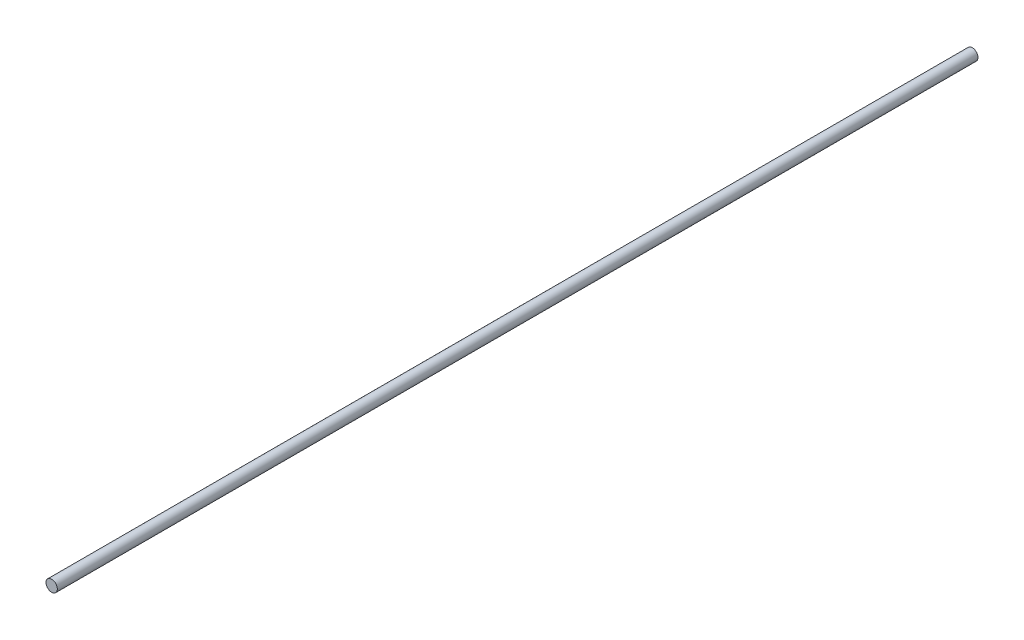
ISO-10303-21;
HEADER;
FILE_DESCRIPTION(('STEP AP214'),'2;1');
FILE_NAME('part.step','',(''),(''),'','','');
FILE_SCHEMA(('AUTOMOTIVE_DESIGN { 1 0 10303 214 1 1 1 1 }'));
ENDSEC;
DATA;
#1=APPLICATION_CONTEXT('core data for automotive mechanical design processes');
#2=APPLICATION_PROTOCOL_DEFINITION('international standard','automotive_design',2000,#1);
#3=PRODUCT_CONTEXT('',#1,'mechanical');
#4=PRODUCT('Part','Part','',(#3));
#5=PRODUCT_RELATED_PRODUCT_CATEGORY('part','',(#4));
#6=PRODUCT_DEFINITION_FORMATION('','',#4);
#7=PRODUCT_DEFINITION_CONTEXT('part definition',#1,'design');
#8=PRODUCT_DEFINITION('design','',#6,#7);
#9=PRODUCT_DEFINITION_SHAPE('','',#8);
#10=(LENGTH_UNIT() NAMED_UNIT(*) SI_UNIT(.MILLI.,.METRE.));
#11=(NAMED_UNIT(*) PLANE_ANGLE_UNIT() SI_UNIT($,.RADIAN.));
#12=(NAMED_UNIT(*) SI_UNIT($,.STERADIAN.) SOLID_ANGLE_UNIT());
#13=UNCERTAINTY_MEASURE_WITH_UNIT(LENGTH_MEASURE(1.E-05),#10,'distance_accuracy_value','');
#14=(GEOMETRIC_REPRESENTATION_CONTEXT(3) GLOBAL_UNCERTAINTY_ASSIGNED_CONTEXT((#13)) GLOBAL_UNIT_ASSIGNED_CONTEXT((#10,
#11,#12)) REPRESENTATION_CONTEXT('',''));
#15=CARTESIAN_POINT('',(0.,0.,0.));
#16=DIRECTION('',(0.,0.,1.));
#17=DIRECTION('',(1.,0.,0.));
#18=AXIS2_PLACEMENT_3D('',#15,#16,#17);
#19=CARTESIAN_POINT('',(0.,0.,-162.));
#20=DIRECTION('',(0.,0.,1.));
#21=DIRECTION('',(1.,0.,0.));
#22=AXIS2_PLACEMENT_3D('',#19,#20,#21);
#23=CYLINDRICAL_SURFACE('',#22,2.);
#24=CARTESIAN_POINT('',(0.,0.,-162.));
#25=DIRECTION('',(0.,0.,1.));
#26=DIRECTION('',(1.,0.,0.));
#27=AXIS2_PLACEMENT_3D('',#24,#25,#26);
#28=CIRCLE('',#27,2.);
#29=CARTESIAN_POINT('',(2.,0.,-162.));
#30=VERTEX_POINT('',#29);
#31=EDGE_CURVE('E10',#30,#30,#28,.T.);
#32=ORIENTED_EDGE('',*,*,#31,.T.);
#33=EDGE_LOOP('',(#32));
#34=FACE_BOUND('',#33,.T.);
#35=CARTESIAN_POINT('',(0.,0.,162.));
#36=DIRECTION('',(0.,0.,1.));
#37=DIRECTION('',(1.,0.,0.));
#38=AXIS2_PLACEMENT_3D('',#35,#36,#37);
#39=CIRCLE('',#38,2.);
#40=CARTESIAN_POINT('',(2.,0.,162.));
#41=VERTEX_POINT('',#40);
#42=EDGE_CURVE('E36',#41,#41,#39,.T.);
#43=ORIENTED_EDGE('',*,*,#42,.F.);
#44=EDGE_LOOP('',(#43));
#45=FACE_BOUND('',#44,.T.);
#46=ADVANCED_FACE('F30',(#34,#45),#23,.T.);
#47=CARTESIAN_POINT('',(0.,0.,-162.));
#48=DIRECTION('',(0.,0.,1.));
#49=DIRECTION('',(1.,0.,0.));
#50=AXIS2_PLACEMENT_3D('',#47,#48,#49);
#51=PLANE('',#50);
#52=ORIENTED_EDGE('',*,*,#31,.F.);
#53=EDGE_LOOP('',(#52));
#54=FACE_BOUND('',#53,.T.);
#55=ADVANCED_FACE('F45',(#54),#51,.F.);
#56=CARTESIAN_POINT('',(0.,0.,162.));
#57=DIRECTION('',(0.,0.,1.));
#58=DIRECTION('',(1.,0.,0.));
#59=AXIS2_PLACEMENT_3D('',#56,#57,#58);
#60=PLANE('',#59);
#61=ORIENTED_EDGE('',*,*,#42,.T.);
#62=EDGE_LOOP('',(#61));
#63=FACE_BOUND('',#62,.T.);
#64=ADVANCED_FACE('F42',(#63),#60,.T.);
#65=CLOSED_SHELL('',(#46,#55,#64));
#66=MANIFOLD_SOLID_BREP('B2',#65);
#67=ADVANCED_BREP_SHAPE_REPRESENTATION('',(#18,#66),#14);
#68=SHAPE_DEFINITION_REPRESENTATION(#9,#67);
ENDSEC;
END-ISO-10303-21;
